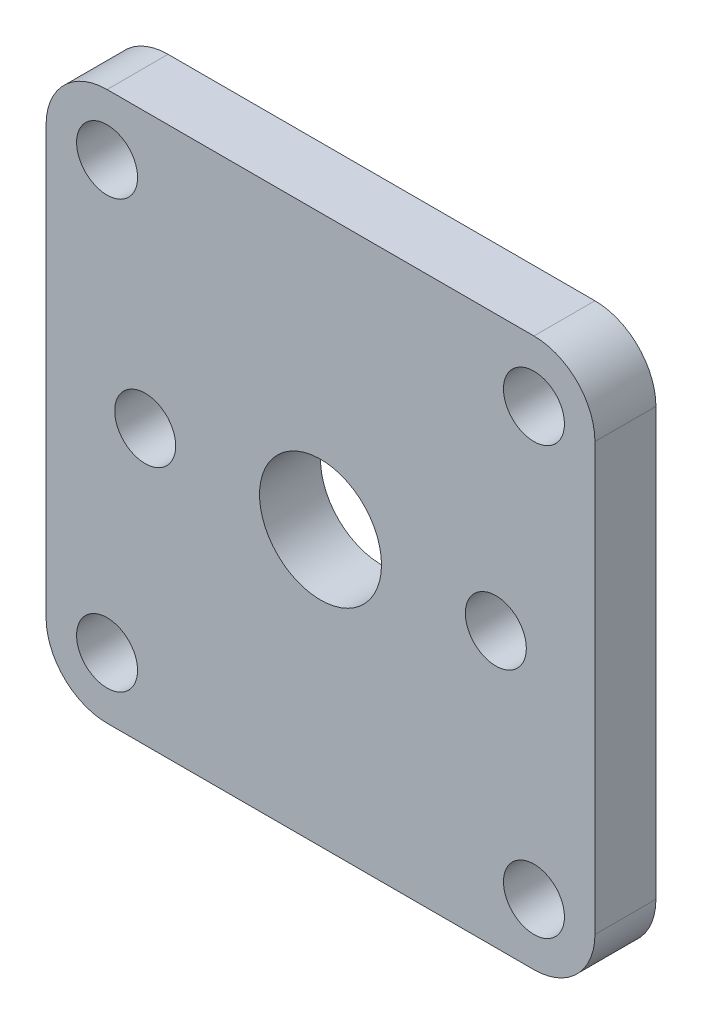
ISO-10303-21;
HEADER;
FILE_DESCRIPTION(('STEP AP214'),'2;1');
FILE_NAME('part.step','',(''),(''),'','','');
FILE_SCHEMA(('AUTOMOTIVE_DESIGN { 1 0 10303 214 1 1 1 1 }'));
ENDSEC;
DATA;
#1=APPLICATION_CONTEXT('core data for automotive mechanical design processes');
#2=APPLICATION_PROTOCOL_DEFINITION('international standard','automotive_design',2000,#1);
#3=PRODUCT_CONTEXT('',#1,'mechanical');
#4=PRODUCT('Part','Part','',(#3));
#5=PRODUCT_RELATED_PRODUCT_CATEGORY('part','',(#4));
#6=PRODUCT_DEFINITION_FORMATION('','',#4);
#7=PRODUCT_DEFINITION_CONTEXT('part definition',#1,'design');
#8=PRODUCT_DEFINITION('design','',#6,#7);
#9=PRODUCT_DEFINITION_SHAPE('','',#8);
#10=(LENGTH_UNIT() NAMED_UNIT(*) SI_UNIT(.MILLI.,.METRE.));
#11=(NAMED_UNIT(*) PLANE_ANGLE_UNIT() SI_UNIT($,.RADIAN.));
#12=(NAMED_UNIT(*) SI_UNIT($,.STERADIAN.) SOLID_ANGLE_UNIT());
#13=UNCERTAINTY_MEASURE_WITH_UNIT(LENGTH_MEASURE(1.E-05),#10,'distance_accuracy_value','');
#14=(GEOMETRIC_REPRESENTATION_CONTEXT(3) GLOBAL_UNCERTAINTY_ASSIGNED_CONTEXT((#13)) GLOBAL_UNIT_ASSIGNED_CONTEXT((#10,
#11,#12)) REPRESENTATION_CONTEXT('',''));
#15=CARTESIAN_POINT('',(0.,0.,0.));
#16=DIRECTION('',(0.,0.,1.));
#17=DIRECTION('',(1.,0.,0.));
#18=AXIS2_PLACEMENT_3D('',#15,#16,#17);
#19=CARTESIAN_POINT('',(0.,0.,2.));
#20=DIRECTION('',(0.,0.,1.));
#21=DIRECTION('',(1.,0.,0.));
#22=AXIS2_PLACEMENT_3D('',#19,#20,#21);
#23=PLANE('',#22);
#24=CARTESIAN_POINT('',(-5.75,0.,2.));
#25=DIRECTION('',(0.,0.,1.));
#26=DIRECTION('',(1.,0.,0.));
#27=AXIS2_PLACEMENT_3D('',#24,#25,#26);
#28=CIRCLE('',#27,0.999999999999987);
#29=CARTESIAN_POINT('',(-4.75000000000001,0.,2.));
#30=VERTEX_POINT('',#29);
#31=EDGE_CURVE('E219',#30,#30,#28,.T.);
#32=ORIENTED_EDGE('',*,*,#31,.F.);
#33=EDGE_LOOP('',(#32));
#34=FACE_BOUND('',#33,.T.);
#35=CARTESIAN_POINT('',(5.75,0.,2.));
#36=DIRECTION('',(0.,0.,1.));
#37=DIRECTION('',(1.,0.,0.));
#38=AXIS2_PLACEMENT_3D('',#35,#36,#37);
#39=CIRCLE('',#38,0.999999999999987);
#40=CARTESIAN_POINT('',(6.74999999999999,0.,2.));
#41=VERTEX_POINT('',#40);
#42=EDGE_CURVE('E213',#41,#41,#39,.T.);
#43=ORIENTED_EDGE('',*,*,#42,.F.);
#44=EDGE_LOOP('',(#43));
#45=FACE_BOUND('',#44,.T.);
#46=CARTESIAN_POINT('',(-7.,7.,2.));
#47=DIRECTION('',(0.,0.,1.));
#48=DIRECTION('',(1.,0.,0.));
#49=AXIS2_PLACEMENT_3D('',#46,#47,#48);
#50=CIRCLE('',#49,0.999999999999999);
#51=CARTESIAN_POINT('',(-6.,7.,2.));
#52=VERTEX_POINT('',#51);
#53=EDGE_CURVE('E207',#52,#52,#50,.T.);
#54=ORIENTED_EDGE('',*,*,#53,.F.);
#55=EDGE_LOOP('',(#54));
#56=FACE_BOUND('',#55,.T.);
#57=CARTESIAN_POINT('',(7.,7.,2.));
#58=DIRECTION('',(0.,0.,1.));
#59=DIRECTION('',(1.,0.,0.));
#60=AXIS2_PLACEMENT_3D('',#57,#58,#59);
#61=CIRCLE('',#60,1.);
#62=CARTESIAN_POINT('',(8.,7.,2.));
#63=VERTEX_POINT('',#62);
#64=EDGE_CURVE('E201',#63,#63,#61,.T.);
#65=ORIENTED_EDGE('',*,*,#64,.F.);
#66=EDGE_LOOP('',(#65));
#67=FACE_BOUND('',#66,.T.);
#68=CARTESIAN_POINT('',(7.,-7.,2.));
#69=DIRECTION('',(0.,0.,1.));
#70=DIRECTION('',(1.,0.,0.));
#71=AXIS2_PLACEMENT_3D('',#68,#69,#70);
#72=CIRCLE('',#71,1.);
#73=CARTESIAN_POINT('',(8.,-7.,2.));
#74=VERTEX_POINT('',#73);
#75=EDGE_CURVE('E195',#74,#74,#72,.T.);
#76=ORIENTED_EDGE('',*,*,#75,.F.);
#77=EDGE_LOOP('',(#76));
#78=FACE_BOUND('',#77,.T.);
#79=CARTESIAN_POINT('',(-7.,-7.,2.));
#80=DIRECTION('',(0.,0.,1.));
#81=DIRECTION('',(1.,0.,0.));
#82=AXIS2_PLACEMENT_3D('',#79,#80,#81);
#83=CIRCLE('',#82,0.999999999999999);
#84=CARTESIAN_POINT('',(-6.,-7.,2.));
#85=VERTEX_POINT('',#84);
#86=EDGE_CURVE('E189',#85,#85,#83,.T.);
#87=ORIENTED_EDGE('',*,*,#86,.F.);
#88=EDGE_LOOP('',(#87));
#89=FACE_BOUND('',#88,.T.);
#90=DIRECTION('',(-1.,0.,0.));
#91=VECTOR('',#90,1.);
#92=CARTESIAN_POINT('',(-9.,9.,2.));
#93=LINE('',#92,#91);
#94=CARTESIAN_POINT('',(7.,9.,2.));
#95=VERTEX_POINT('',#94);
#96=CARTESIAN_POINT('',(-7.,9.,2.));
#97=VERTEX_POINT('',#96);
#98=EDGE_CURVE('E171',#95,#97,#93,.T.);
#99=ORIENTED_EDGE('',*,*,#98,.T.);
#100=CARTESIAN_POINT('',(-7.,7.,2.));
#101=DIRECTION('',(0.,0.,1.));
#102=DIRECTION('',(1.,0.,0.));
#103=AXIS2_PLACEMENT_3D('',#100,#101,#102);
#104=CIRCLE('',#103,2.);
#105=CARTESIAN_POINT('',(-9.,7.,2.));
#106=VERTEX_POINT('',#105);
#107=EDGE_CURVE('E152',#97,#106,#104,.T.);
#108=ORIENTED_EDGE('',*,*,#107,.T.);
#109=DIRECTION('',(0.,-1.,0.));
#110=VECTOR('',#109,1.);
#111=CARTESIAN_POINT('',(-9.,9.,2.));
#112=LINE('',#111,#110);
#113=CARTESIAN_POINT('',(-9.,-7.,2.));
#114=VERTEX_POINT('',#113);
#115=EDGE_CURVE('E122',#106,#114,#112,.T.);
#116=ORIENTED_EDGE('',*,*,#115,.T.);
#117=CARTESIAN_POINT('',(-7.,-7.,2.));
#118=DIRECTION('',(0.,0.,1.));
#119=DIRECTION('',(1.,0.,0.));
#120=AXIS2_PLACEMENT_3D('',#117,#118,#119);
#121=CIRCLE('',#120,2.);
#122=CARTESIAN_POINT('',(-7.,-9.,2.));
#123=VERTEX_POINT('',#122);
#124=EDGE_CURVE('E58',#114,#123,#121,.T.);
#125=ORIENTED_EDGE('',*,*,#124,.T.);
#126=DIRECTION('',(1.,0.,0.));
#127=VECTOR('',#126,1.);
#128=CARTESIAN_POINT('',(-9.,-9.,2.));
#129=LINE('',#128,#127);
#130=CARTESIAN_POINT('',(7.,-9.,2.));
#131=VERTEX_POINT('',#130);
#132=EDGE_CURVE('E138',#123,#131,#129,.T.);
#133=ORIENTED_EDGE('',*,*,#132,.T.);
#134=CARTESIAN_POINT('',(7.,-7.,2.));
#135=DIRECTION('',(0.,0.,1.));
#136=DIRECTION('',(1.,0.,0.));
#137=AXIS2_PLACEMENT_3D('',#134,#135,#136);
#138=CIRCLE('',#137,2.);
#139=CARTESIAN_POINT('',(9.,-7.,2.));
#140=VERTEX_POINT('',#139);
#141=EDGE_CURVE('E149',#131,#140,#138,.T.);
#142=ORIENTED_EDGE('',*,*,#141,.T.);
#143=DIRECTION('',(0.,1.,0.));
#144=VECTOR('',#143,1.);
#145=CARTESIAN_POINT('',(9.,9.,2.));
#146=LINE('',#145,#144);
#147=CARTESIAN_POINT('',(9.,7.,2.));
#148=VERTEX_POINT('',#147);
#149=EDGE_CURVE('E132',#140,#148,#146,.T.);
#150=ORIENTED_EDGE('',*,*,#149,.T.);
#151=CARTESIAN_POINT('',(7.,7.,2.));
#152=DIRECTION('',(0.,0.,1.));
#153=DIRECTION('',(1.,0.,0.));
#154=AXIS2_PLACEMENT_3D('',#151,#152,#153);
#155=CIRCLE('',#154,2.);
#156=EDGE_CURVE('E147',#148,#95,#155,.T.);
#157=ORIENTED_EDGE('',*,*,#156,.T.);
#158=EDGE_LOOP('',(#99,#108,#116,#125,#133,#142,#150,#157));
#159=FACE_BOUND('',#158,.T.);
#160=CARTESIAN_POINT('',(0.,0.,2.));
#161=DIRECTION('',(0.,0.,1.));
#162=DIRECTION('',(1.,0.,0.));
#163=AXIS2_PLACEMENT_3D('',#160,#161,#162);
#164=CIRCLE('',#163,2.);
#165=CARTESIAN_POINT('',(2.,0.,2.));
#166=VERTEX_POINT('',#165);
#167=EDGE_CURVE('E176',#166,#166,#164,.T.);
#168=ORIENTED_EDGE('',*,*,#167,.F.);
#169=EDGE_LOOP('',(#168));
#170=FACE_BOUND('',#169,.T.);
#171=ADVANCED_FACE('F36',(#34,#45,#56,#67,#78,#89,#159,#170),#23,.T.);
#172=CARTESIAN_POINT('',(0.,0.,0.));
#173=DIRECTION('',(0.,0.,1.));
#174=DIRECTION('',(1.,0.,0.));
#175=AXIS2_PLACEMENT_3D('',#172,#173,#174);
#176=PLANE('',#175);
#177=CARTESIAN_POINT('',(-5.75,0.,0.));
#178=DIRECTION('',(0.,0.,1.));
#179=DIRECTION('',(1.,0.,0.));
#180=AXIS2_PLACEMENT_3D('',#177,#178,#179);
#181=CIRCLE('',#180,0.999999999999999);
#182=CARTESIAN_POINT('',(-4.75,0.,0.));
#183=VERTEX_POINT('',#182);
#184=EDGE_CURVE('E216',#183,#183,#181,.T.);
#185=ORIENTED_EDGE('',*,*,#184,.T.);
#186=EDGE_LOOP('',(#185));
#187=FACE_BOUND('',#186,.T.);
#188=CARTESIAN_POINT('',(5.75,0.,0.));
#189=DIRECTION('',(0.,0.,1.));
#190=DIRECTION('',(1.,0.,0.));
#191=AXIS2_PLACEMENT_3D('',#188,#189,#190);
#192=CIRCLE('',#191,0.999999999999999);
#193=CARTESIAN_POINT('',(6.75,0.,0.));
#194=VERTEX_POINT('',#193);
#195=EDGE_CURVE('E210',#194,#194,#192,.T.);
#196=ORIENTED_EDGE('',*,*,#195,.T.);
#197=EDGE_LOOP('',(#196));
#198=FACE_BOUND('',#197,.T.);
#199=CARTESIAN_POINT('',(-7.,7.,0.));
#200=DIRECTION('',(0.,0.,1.));
#201=DIRECTION('',(1.,0.,0.));
#202=AXIS2_PLACEMENT_3D('',#199,#200,#201);
#203=CIRCLE('',#202,0.999999999999999);
#204=CARTESIAN_POINT('',(-6.,7.,0.));
#205=VERTEX_POINT('',#204);
#206=EDGE_CURVE('E204',#205,#205,#203,.T.);
#207=ORIENTED_EDGE('',*,*,#206,.T.);
#208=EDGE_LOOP('',(#207));
#209=FACE_BOUND('',#208,.T.);
#210=CARTESIAN_POINT('',(7.,7.,0.));
#211=DIRECTION('',(0.,0.,1.));
#212=DIRECTION('',(1.,0.,0.));
#213=AXIS2_PLACEMENT_3D('',#210,#211,#212);
#214=CIRCLE('',#213,1.);
#215=CARTESIAN_POINT('',(8.,7.,0.));
#216=VERTEX_POINT('',#215);
#217=EDGE_CURVE('E198',#216,#216,#214,.T.);
#218=ORIENTED_EDGE('',*,*,#217,.T.);
#219=EDGE_LOOP('',(#218));
#220=FACE_BOUND('',#219,.T.);
#221=CARTESIAN_POINT('',(7.,-7.,0.));
#222=DIRECTION('',(0.,0.,1.));
#223=DIRECTION('',(1.,0.,0.));
#224=AXIS2_PLACEMENT_3D('',#221,#222,#223);
#225=CIRCLE('',#224,1.);
#226=CARTESIAN_POINT('',(8.,-7.,0.));
#227=VERTEX_POINT('',#226);
#228=EDGE_CURVE('E192',#227,#227,#225,.T.);
#229=ORIENTED_EDGE('',*,*,#228,.T.);
#230=EDGE_LOOP('',(#229));
#231=FACE_BOUND('',#230,.T.);
#232=CARTESIAN_POINT('',(-7.,-7.,0.));
#233=DIRECTION('',(0.,0.,1.));
#234=DIRECTION('',(1.,0.,0.));
#235=AXIS2_PLACEMENT_3D('',#232,#233,#234);
#236=CIRCLE('',#235,0.999999999999999);
#237=CARTESIAN_POINT('',(-6.,-7.,0.));
#238=VERTEX_POINT('',#237);
#239=EDGE_CURVE('E185',#238,#238,#236,.T.);
#240=ORIENTED_EDGE('',*,*,#239,.T.);
#241=EDGE_LOOP('',(#240));
#242=FACE_BOUND('',#241,.T.);
#243=DIRECTION('',(0.,-1.,0.));
#244=VECTOR('',#243,1.);
#245=CARTESIAN_POINT('',(-9.,9.,0.));
#246=LINE('',#245,#244);
#247=CARTESIAN_POINT('',(-9.,7.,0.));
#248=VERTEX_POINT('',#247);
#249=CARTESIAN_POINT('',(-9.,-7.,0.));
#250=VERTEX_POINT('',#249);
#251=EDGE_CURVE('E120',#248,#250,#246,.T.);
#252=ORIENTED_EDGE('',*,*,#251,.F.);
#253=CARTESIAN_POINT('',(-7.,7.,0.));
#254=DIRECTION('',(0.,0.,1.));
#255=DIRECTION('',(1.,0.,0.));
#256=AXIS2_PLACEMENT_3D('',#253,#254,#255);
#257=CIRCLE('',#256,2.);
#258=CARTESIAN_POINT('',(-7.,9.,0.));
#259=VERTEX_POINT('',#258);
#260=EDGE_CURVE('E103',#248,#259,#257,.F.);
#261=ORIENTED_EDGE('',*,*,#260,.T.);
#262=DIRECTION('',(-1.,0.,0.));
#263=VECTOR('',#262,1.);
#264=CARTESIAN_POINT('',(-9.,9.,0.));
#265=LINE('',#264,#263);
#266=CARTESIAN_POINT('',(7.,9.,0.));
#267=VERTEX_POINT('',#266);
#268=EDGE_CURVE('E130',#267,#259,#265,.T.);
#269=ORIENTED_EDGE('',*,*,#268,.F.);
#270=CARTESIAN_POINT('',(7.,7.,0.));
#271=DIRECTION('',(0.,0.,1.));
#272=DIRECTION('',(1.,0.,0.));
#273=AXIS2_PLACEMENT_3D('',#270,#271,#272);
#274=CIRCLE('',#273,2.);
#275=CARTESIAN_POINT('',(9.,7.,0.));
#276=VERTEX_POINT('',#275);
#277=EDGE_CURVE('E123',#267,#276,#274,.F.);
#278=ORIENTED_EDGE('',*,*,#277,.T.);
#279=DIRECTION('',(0.,1.,0.));
#280=VECTOR('',#279,1.);
#281=CARTESIAN_POINT('',(9.,9.,0.));
#282=LINE('',#281,#280);
#283=CARTESIAN_POINT('',(9.,-7.,0.));
#284=VERTEX_POINT('',#283);
#285=EDGE_CURVE('E134',#284,#276,#282,.T.);
#286=ORIENTED_EDGE('',*,*,#285,.F.);
#287=CARTESIAN_POINT('',(7.,-7.,0.));
#288=DIRECTION('',(0.,0.,1.));
#289=DIRECTION('',(1.,0.,0.));
#290=AXIS2_PLACEMENT_3D('',#287,#288,#289);
#291=CIRCLE('',#290,2.);
#292=CARTESIAN_POINT('',(7.,-9.,0.));
#293=VERTEX_POINT('',#292);
#294=EDGE_CURVE('E141',#284,#293,#291,.F.);
#295=ORIENTED_EDGE('',*,*,#294,.T.);
#296=DIRECTION('',(1.,0.,0.));
#297=VECTOR('',#296,1.);
#298=CARTESIAN_POINT('',(-9.,-9.,0.));
#299=LINE('',#298,#297);
#300=CARTESIAN_POINT('',(-7.,-9.,0.));
#301=VERTEX_POINT('',#300);
#302=EDGE_CURVE('E129',#301,#293,#299,.T.);
#303=ORIENTED_EDGE('',*,*,#302,.F.);
#304=CARTESIAN_POINT('',(-7.,-7.,0.));
#305=DIRECTION('',(0.,0.,1.));
#306=DIRECTION('',(1.,0.,0.));
#307=AXIS2_PLACEMENT_3D('',#304,#305,#306);
#308=CIRCLE('',#307,2.);
#309=EDGE_CURVE('E114',#301,#250,#308,.F.);
#310=ORIENTED_EDGE('',*,*,#309,.T.);
#311=EDGE_LOOP('',(#252,#261,#269,#278,#286,#295,#303,#310));
#312=FACE_BOUND('',#311,.T.);
#313=CARTESIAN_POINT('',(0.,0.,0.));
#314=DIRECTION('',(0.,0.,1.));
#315=DIRECTION('',(1.,0.,0.));
#316=AXIS2_PLACEMENT_3D('',#313,#314,#315);
#317=CIRCLE('',#316,2.);
#318=CARTESIAN_POINT('',(2.,0.,0.));
#319=VERTEX_POINT('',#318);
#320=EDGE_CURVE('E178',#319,#319,#317,.T.);
#321=ORIENTED_EDGE('',*,*,#320,.T.);
#322=EDGE_LOOP('',(#321));
#323=FACE_BOUND('',#322,.T.);
#324=ADVANCED_FACE('F126',(#187,#198,#209,#220,#231,#242,#312,#323),#176,.F.);
#325=CARTESIAN_POINT('',(9.,9.,2.));
#326=DIRECTION('',(-1.,0.,0.));
#327=DIRECTION('',(0.,-1.,0.));
#328=AXIS2_PLACEMENT_3D('',#325,#326,#327);
#329=PLANE('',#328);
#330=ORIENTED_EDGE('',*,*,#149,.F.);
#331=DIRECTION('',(0.,0.,-1.));
#332=VECTOR('',#331,1.);
#333=CARTESIAN_POINT('',(9.,-7.,2.));
#334=LINE('',#333,#332);
#335=EDGE_CURVE('E11',#140,#284,#334,.T.);
#336=ORIENTED_EDGE('',*,*,#335,.T.);
#337=ORIENTED_EDGE('',*,*,#285,.T.);
#338=DIRECTION('',(0.,0.,-1.));
#339=VECTOR('',#338,1.);
#340=CARTESIAN_POINT('',(9.,7.,2.));
#341=LINE('',#340,#339);
#342=EDGE_CURVE('E44',#276,#148,#341,.F.);
#343=ORIENTED_EDGE('',*,*,#342,.T.);
#344=EDGE_LOOP('',(#330,#336,#337,#343));
#345=FACE_BOUND('',#344,.T.);
#346=ADVANCED_FACE('F162',(#345),#329,.F.);
#347=CARTESIAN_POINT('',(-9.,9.,2.));
#348=DIRECTION('',(0.,-1.,0.));
#349=DIRECTION('',(0.,0.,-1.));
#350=AXIS2_PLACEMENT_3D('',#347,#348,#349);
#351=PLANE('',#350);
#352=ORIENTED_EDGE('',*,*,#268,.T.);
#353=DIRECTION('',(0.,0.,-1.));
#354=VECTOR('',#353,1.);
#355=CARTESIAN_POINT('',(-7.,9.,2.));
#356=LINE('',#355,#354);
#357=EDGE_CURVE('E108',#259,#97,#356,.F.);
#358=ORIENTED_EDGE('',*,*,#357,.T.);
#359=ORIENTED_EDGE('',*,*,#98,.F.);
#360=DIRECTION('',(0.,0.,-1.));
#361=VECTOR('',#360,1.);
#362=CARTESIAN_POINT('',(7.,9.,2.));
#363=LINE('',#362,#361);
#364=EDGE_CURVE('E113',#95,#267,#363,.T.);
#365=ORIENTED_EDGE('',*,*,#364,.T.);
#366=EDGE_LOOP('',(#352,#358,#359,#365));
#367=FACE_BOUND('',#366,.T.);
#368=ADVANCED_FACE('F175',(#367),#351,.F.);
#369=CARTESIAN_POINT('',(-9.,9.,2.));
#370=DIRECTION('',(1.,0.,0.));
#371=DIRECTION('',(0.,1.,0.));
#372=AXIS2_PLACEMENT_3D('',#369,#370,#371);
#373=PLANE('',#372);
#374=ORIENTED_EDGE('',*,*,#115,.F.);
#375=DIRECTION('',(0.,0.,-1.));
#376=VECTOR('',#375,1.);
#377=CARTESIAN_POINT('',(-9.,7.,2.));
#378=LINE('',#377,#376);
#379=EDGE_CURVE('E107',#106,#248,#378,.T.);
#380=ORIENTED_EDGE('',*,*,#379,.T.);
#381=ORIENTED_EDGE('',*,*,#251,.T.);
#382=DIRECTION('',(0.,0.,-1.));
#383=VECTOR('',#382,1.);
#384=CARTESIAN_POINT('',(-9.,-7.,2.));
#385=LINE('',#384,#383);
#386=EDGE_CURVE('E124',#250,#114,#385,.F.);
#387=ORIENTED_EDGE('',*,*,#386,.T.);
#388=EDGE_LOOP('',(#374,#380,#381,#387));
#389=FACE_BOUND('',#388,.T.);
#390=ADVANCED_FACE('F119',(#389),#373,.F.);
#391=CARTESIAN_POINT('',(-9.,-9.,2.));
#392=DIRECTION('',(0.,1.,0.));
#393=DIRECTION('',(0.,0.,1.));
#394=AXIS2_PLACEMENT_3D('',#391,#392,#393);
#395=PLANE('',#394);
#396=ORIENTED_EDGE('',*,*,#132,.F.);
#397=DIRECTION('',(0.,0.,-1.));
#398=VECTOR('',#397,1.);
#399=CARTESIAN_POINT('',(-7.,-9.,2.));
#400=LINE('',#399,#398);
#401=EDGE_CURVE('E155',#123,#301,#400,.T.);
#402=ORIENTED_EDGE('',*,*,#401,.T.);
#403=ORIENTED_EDGE('',*,*,#302,.T.);
#404=DIRECTION('',(0.,0.,-1.));
#405=VECTOR('',#404,1.);
#406=CARTESIAN_POINT('',(7.,-9.,2.));
#407=LINE('',#406,#405);
#408=EDGE_CURVE('E51',#293,#131,#407,.F.);
#409=ORIENTED_EDGE('',*,*,#408,.T.);
#410=EDGE_LOOP('',(#396,#402,#403,#409));
#411=FACE_BOUND('',#410,.T.);
#412=ADVANCED_FACE('F251',(#411),#395,.F.);
#413=CARTESIAN_POINT('',(0.,0.,2.));
#414=DIRECTION('',(0.,0.,-1.));
#415=DIRECTION('',(-1.,0.,0.));
#416=AXIS2_PLACEMENT_3D('',#413,#414,#415);
#417=CYLINDRICAL_SURFACE('',#416,2.);
#418=ORIENTED_EDGE('',*,*,#167,.T.);
#419=EDGE_LOOP('',(#418));
#420=FACE_BOUND('',#419,.T.);
#421=ORIENTED_EDGE('',*,*,#320,.F.);
#422=EDGE_LOOP('',(#421));
#423=FACE_BOUND('',#422,.T.);
#424=ADVANCED_FACE('F241',(#420,#423),#417,.F.);
#425=CARTESIAN_POINT('',(-7.,-7.,2.));
#426=DIRECTION('',(0.,0.,1.));
#427=DIRECTION('',(1.,0.,0.));
#428=AXIS2_PLACEMENT_3D('',#425,#426,#427);
#429=CYLINDRICAL_SURFACE('',#428,0.999999999999999);
#430=ORIENTED_EDGE('',*,*,#239,.F.);
#431=EDGE_LOOP('',(#430));
#432=FACE_BOUND('',#431,.T.);
#433=ORIENTED_EDGE('',*,*,#86,.T.);
#434=EDGE_LOOP('',(#433));
#435=FACE_BOUND('',#434,.T.);
#436=ADVANCED_FACE('F238',(#432,#435),#429,.F.);
#437=CARTESIAN_POINT('',(7.,-7.,2.));
#438=DIRECTION('',(0.,0.,1.));
#439=DIRECTION('',(1.,0.,0.));
#440=AXIS2_PLACEMENT_3D('',#437,#438,#439);
#441=CYLINDRICAL_SURFACE('',#440,1.);
#442=ORIENTED_EDGE('',*,*,#228,.F.);
#443=EDGE_LOOP('',(#442));
#444=FACE_BOUND('',#443,.T.);
#445=ORIENTED_EDGE('',*,*,#75,.T.);
#446=EDGE_LOOP('',(#445));
#447=FACE_BOUND('',#446,.T.);
#448=ADVANCED_FACE('F240',(#444,#447),#441,.F.);
#449=CARTESIAN_POINT('',(7.,7.,2.));
#450=DIRECTION('',(0.,0.,1.));
#451=DIRECTION('',(1.,0.,0.));
#452=AXIS2_PLACEMENT_3D('',#449,#450,#451);
#453=CYLINDRICAL_SURFACE('',#452,1.);
#454=ORIENTED_EDGE('',*,*,#217,.F.);
#455=EDGE_LOOP('',(#454));
#456=FACE_BOUND('',#455,.T.);
#457=ORIENTED_EDGE('',*,*,#64,.T.);
#458=EDGE_LOOP('',(#457));
#459=FACE_BOUND('',#458,.T.);
#460=ADVANCED_FACE('F248',(#456,#459),#453,.F.);
#461=CARTESIAN_POINT('',(-7.,7.,2.));
#462=DIRECTION('',(0.,0.,1.));
#463=DIRECTION('',(1.,0.,0.));
#464=AXIS2_PLACEMENT_3D('',#461,#462,#463);
#465=CYLINDRICAL_SURFACE('',#464,0.999999999999999);
#466=ORIENTED_EDGE('',*,*,#206,.F.);
#467=EDGE_LOOP('',(#466));
#468=FACE_BOUND('',#467,.T.);
#469=ORIENTED_EDGE('',*,*,#53,.T.);
#470=EDGE_LOOP('',(#469));
#471=FACE_BOUND('',#470,.T.);
#472=ADVANCED_FACE('F271',(#468,#471),#465,.F.);
#473=CARTESIAN_POINT('',(-7.,7.,2.));
#474=DIRECTION('',(0.,0.,-1.));
#475=DIRECTION('',(-1.,0.,0.));
#476=AXIS2_PLACEMENT_3D('',#473,#474,#475);
#477=CYLINDRICAL_SURFACE('',#476,2.);
#478=ORIENTED_EDGE('',*,*,#107,.F.);
#479=ORIENTED_EDGE('',*,*,#357,.F.);
#480=ORIENTED_EDGE('',*,*,#260,.F.);
#481=ORIENTED_EDGE('',*,*,#379,.F.);
#482=EDGE_LOOP('',(#478,#479,#480,#481));
#483=FACE_BOUND('',#482,.T.);
#484=ADVANCED_FACE('F106',(#483),#477,.T.);
#485=CARTESIAN_POINT('',(-7.,-7.,2.));
#486=DIRECTION('',(0.,0.,-1.));
#487=DIRECTION('',(-1.,0.,0.));
#488=AXIS2_PLACEMENT_3D('',#485,#486,#487);
#489=CYLINDRICAL_SURFACE('',#488,2.);
#490=ORIENTED_EDGE('',*,*,#124,.F.);
#491=ORIENTED_EDGE('',*,*,#386,.F.);
#492=ORIENTED_EDGE('',*,*,#309,.F.);
#493=ORIENTED_EDGE('',*,*,#401,.F.);
#494=EDGE_LOOP('',(#490,#491,#492,#493));
#495=FACE_BOUND('',#494,.T.);
#496=ADVANCED_FACE('F270',(#495),#489,.T.);
#497=CARTESIAN_POINT('',(7.,-7.,2.));
#498=DIRECTION('',(0.,0.,-1.));
#499=DIRECTION('',(-1.,0.,0.));
#500=AXIS2_PLACEMENT_3D('',#497,#498,#499);
#501=CYLINDRICAL_SURFACE('',#500,2.);
#502=ORIENTED_EDGE('',*,*,#141,.F.);
#503=ORIENTED_EDGE('',*,*,#408,.F.);
#504=ORIENTED_EDGE('',*,*,#294,.F.);
#505=ORIENTED_EDGE('',*,*,#335,.F.);
#506=EDGE_LOOP('',(#502,#503,#504,#505));
#507=FACE_BOUND('',#506,.T.);
#508=ADVANCED_FACE('F273',(#507),#501,.T.);
#509=CARTESIAN_POINT('',(7.,7.,2.));
#510=DIRECTION('',(0.,0.,-1.));
#511=DIRECTION('',(-1.,0.,0.));
#512=AXIS2_PLACEMENT_3D('',#509,#510,#511);
#513=CYLINDRICAL_SURFACE('',#512,2.);
#514=ORIENTED_EDGE('',*,*,#156,.F.);
#515=ORIENTED_EDGE('',*,*,#342,.F.);
#516=ORIENTED_EDGE('',*,*,#277,.F.);
#517=ORIENTED_EDGE('',*,*,#364,.F.);
#518=EDGE_LOOP('',(#514,#515,#516,#517));
#519=FACE_BOUND('',#518,.T.);
#520=ADVANCED_FACE('F38',(#519),#513,.T.);
#521=CARTESIAN_POINT('',(5.75,0.,2.));
#522=DIRECTION('',(0.,0.,1.));
#523=DIRECTION('',(1.,0.,0.));
#524=AXIS2_PLACEMENT_3D('',#521,#522,#523);
#525=CYLINDRICAL_SURFACE('',#524,0.999999999999993);
#526=ORIENTED_EDGE('',*,*,#195,.F.);
#527=EDGE_LOOP('',(#526));
#528=FACE_BOUND('',#527,.T.);
#529=ORIENTED_EDGE('',*,*,#42,.T.);
#530=EDGE_LOOP('',(#529));
#531=FACE_BOUND('',#530,.T.);
#532=ADVANCED_FACE('F280',(#528,#531),#525,.F.);
#533=CARTESIAN_POINT('',(-5.75,0.,2.));
#534=DIRECTION('',(0.,0.,1.));
#535=DIRECTION('',(1.,0.,0.));
#536=AXIS2_PLACEMENT_3D('',#533,#534,#535);
#537=CYLINDRICAL_SURFACE('',#536,0.999999999999993);
#538=ORIENTED_EDGE('',*,*,#184,.F.);
#539=EDGE_LOOP('',(#538));
#540=FACE_BOUND('',#539,.T.);
#541=ORIENTED_EDGE('',*,*,#31,.T.);
#542=EDGE_LOOP('',(#541));
#543=FACE_BOUND('',#542,.T.);
#544=ADVANCED_FACE('F223',(#540,#543),#537,.F.);
#545=CLOSED_SHELL('',(#171,#324,#346,#368,#390,#412,#424,#436,#448,#460,#472,#484,#496,#508,
#520,#532,#544));
#546=MANIFOLD_SOLID_BREP('B2',#545);
#547=ADVANCED_BREP_SHAPE_REPRESENTATION('',(#18,#546),#14);
#548=SHAPE_DEFINITION_REPRESENTATION(#9,#547);
ENDSEC;
END-ISO-10303-21;
